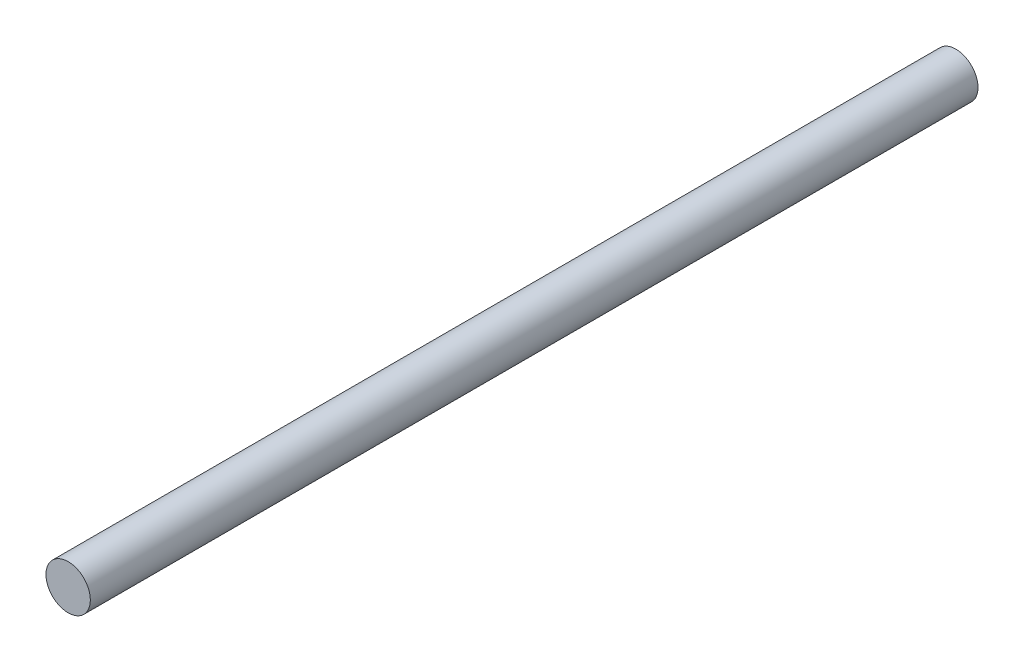
ISO-10303-21;
HEADER;
FILE_DESCRIPTION(('STEP AP214'),'2;1');
FILE_NAME('part.step','',(''),(''),'','','');
FILE_SCHEMA(('AUTOMOTIVE_DESIGN { 1 0 10303 214 1 1 1 1 }'));
ENDSEC;
DATA;
#1=APPLICATION_CONTEXT('core data for automotive mechanical design processes');
#2=APPLICATION_PROTOCOL_DEFINITION('international standard','automotive_design',2000,#1);
#3=PRODUCT_CONTEXT('',#1,'mechanical');
#4=PRODUCT('Part','Part','',(#3));
#5=PRODUCT_RELATED_PRODUCT_CATEGORY('part','',(#4));
#6=PRODUCT_DEFINITION_FORMATION('','',#4);
#7=PRODUCT_DEFINITION_CONTEXT('part definition',#1,'design');
#8=PRODUCT_DEFINITION('design','',#6,#7);
#9=PRODUCT_DEFINITION_SHAPE('','',#8);
#10=(LENGTH_UNIT() NAMED_UNIT(*) SI_UNIT(.MILLI.,.METRE.));
#11=(NAMED_UNIT(*) PLANE_ANGLE_UNIT() SI_UNIT($,.RADIAN.));
#12=(NAMED_UNIT(*) SI_UNIT($,.STERADIAN.) SOLID_ANGLE_UNIT());
#13=UNCERTAINTY_MEASURE_WITH_UNIT(LENGTH_MEASURE(1.E-05),#10,'distance_accuracy_value','');
#14=(GEOMETRIC_REPRESENTATION_CONTEXT(3) GLOBAL_UNCERTAINTY_ASSIGNED_CONTEXT((#13)) GLOBAL_UNIT_ASSIGNED_CONTEXT((#10,
#11,#12)) REPRESENTATION_CONTEXT('',''));
#15=CARTESIAN_POINT('',(0.,0.,0.));
#16=DIRECTION('',(0.,0.,1.));
#17=DIRECTION('',(1.,0.,0.));
#18=AXIS2_PLACEMENT_3D('',#15,#16,#17);
#19=CARTESIAN_POINT('',(0.,0.,100.));
#20=DIRECTION('',(0.,0.,-1.));
#21=DIRECTION('',(-1.,0.,0.));
#22=AXIS2_PLACEMENT_3D('',#19,#20,#21);
#23=CYLINDRICAL_SURFACE('',#22,2.5);
#24=CARTESIAN_POINT('',(0.,0.,100.));
#25=DIRECTION('',(0.,0.,1.));
#26=DIRECTION('',(1.,0.,0.));
#27=AXIS2_PLACEMENT_3D('',#24,#25,#26);
#28=CIRCLE('',#27,2.5);
#29=CARTESIAN_POINT('',(2.5,0.,100.));
#30=VERTEX_POINT('',#29);
#31=EDGE_CURVE('E10',#30,#30,#28,.T.);
#32=ORIENTED_EDGE('',*,*,#31,.F.);
#33=EDGE_LOOP('',(#32));
#34=FACE_BOUND('',#33,.T.);
#35=CARTESIAN_POINT('',(0.,0.,0.));
#36=DIRECTION('',(0.,0.,1.));
#37=DIRECTION('',(1.,0.,0.));
#38=AXIS2_PLACEMENT_3D('',#35,#36,#37);
#39=CIRCLE('',#38,2.5);
#40=CARTESIAN_POINT('',(2.5,0.,0.));
#41=VERTEX_POINT('',#40);
#42=EDGE_CURVE('E42',#41,#41,#39,.T.);
#43=ORIENTED_EDGE('',*,*,#42,.T.);
#44=EDGE_LOOP('',(#43));
#45=FACE_BOUND('',#44,.T.);
#46=ADVANCED_FACE('F39',(#34,#45),#23,.T.);
#47=CARTESIAN_POINT('',(0.,0.,100.));
#48=DIRECTION('',(0.,0.,1.));
#49=DIRECTION('',(1.,0.,0.));
#50=AXIS2_PLACEMENT_3D('',#47,#48,#49);
#51=PLANE('',#50);
#52=ORIENTED_EDGE('',*,*,#31,.T.);
#53=EDGE_LOOP('',(#52));
#54=FACE_BOUND('',#53,.T.);
#55=ADVANCED_FACE('F54',(#54),#51,.T.);
#56=CARTESIAN_POINT('',(0.,0.,0.));
#57=DIRECTION('',(0.,0.,1.));
#58=DIRECTION('',(1.,0.,0.));
#59=AXIS2_PLACEMENT_3D('',#56,#57,#58);
#60=PLANE('',#59);
#61=ORIENTED_EDGE('',*,*,#42,.F.);
#62=EDGE_LOOP('',(#61));
#63=FACE_BOUND('',#62,.T.);
#64=ADVANCED_FACE('F52',(#63),#60,.F.);
#65=CLOSED_SHELL('',(#46,#55,#64));
#66=MANIFOLD_SOLID_BREP('B2',#65);
#67=ADVANCED_BREP_SHAPE_REPRESENTATION('',(#18,#66),#14);
#68=SHAPE_DEFINITION_REPRESENTATION(#9,#67);
ENDSEC;
END-ISO-10303-21;
